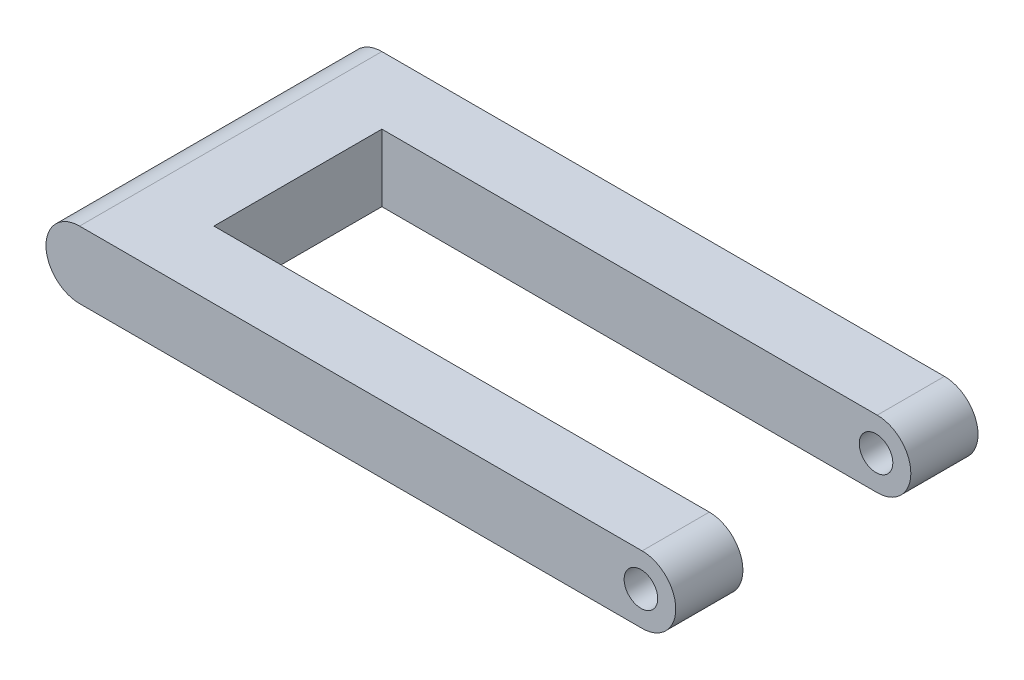
ISO-10303-21;
HEADER;
FILE_DESCRIPTION(('STEP AP214'),'2;1');
FILE_NAME('part.step','',(''),(''),'','','');
FILE_SCHEMA(('AUTOMOTIVE_DESIGN { 1 0 10303 214 1 1 1 1 }'));
ENDSEC;
DATA;
#1=APPLICATION_CONTEXT('core data for automotive mechanical design processes');
#2=APPLICATION_PROTOCOL_DEFINITION('international standard','automotive_design',2000,#1);
#3=PRODUCT_CONTEXT('',#1,'mechanical');
#4=PRODUCT('Part','Part','',(#3));
#5=PRODUCT_RELATED_PRODUCT_CATEGORY('part','',(#4));
#6=PRODUCT_DEFINITION_FORMATION('','',#4);
#7=PRODUCT_DEFINITION_CONTEXT('part definition',#1,'design');
#8=PRODUCT_DEFINITION('design','',#6,#7);
#9=PRODUCT_DEFINITION_SHAPE('','',#8);
#10=(LENGTH_UNIT() NAMED_UNIT(*) SI_UNIT(.MILLI.,.METRE.));
#11=(NAMED_UNIT(*) PLANE_ANGLE_UNIT() SI_UNIT($,.RADIAN.));
#12=(NAMED_UNIT(*) SI_UNIT($,.STERADIAN.) SOLID_ANGLE_UNIT());
#13=UNCERTAINTY_MEASURE_WITH_UNIT(LENGTH_MEASURE(1.E-05),#10,'distance_accuracy_value','');
#14=(GEOMETRIC_REPRESENTATION_CONTEXT(3) GLOBAL_UNCERTAINTY_ASSIGNED_CONTEXT((#13)) GLOBAL_UNIT_ASSIGNED_CONTEXT((#10,
#11,#12)) REPRESENTATION_CONTEXT('',''));
#15=CARTESIAN_POINT('',(0.,0.,0.));
#16=DIRECTION('',(0.,0.,1.));
#17=DIRECTION('',(1.,0.,0.));
#18=AXIS2_PLACEMENT_3D('',#15,#16,#17);
#19=CARTESIAN_POINT('',(0.,2.,4.));
#20=DIRECTION('',(0.,0.,-1.));
#21=DIRECTION('',(-1.,0.,0.));
#22=AXIS2_PLACEMENT_3D('',#19,#20,#21);
#23=CYLINDRICAL_SURFACE('',#22,2.);
#24=CARTESIAN_POINT('',(0.,2.,0.));
#25=DIRECTION('',(0.,0.,1.));
#26=DIRECTION('',(1.,0.,0.));
#27=AXIS2_PLACEMENT_3D('',#24,#25,#26);
#28=CIRCLE('',#27,2.);
#29=CARTESIAN_POINT('',(0.,4.,0.));
#30=VERTEX_POINT('',#29);
#31=CARTESIAN_POINT('',(0.,0.,0.));
#32=VERTEX_POINT('',#31);
#33=EDGE_CURVE('E96',#30,#32,#28,.T.);
#34=ORIENTED_EDGE('',*,*,#33,.T.);
#35=DIRECTION('',(0.,0.,-1.));
#36=VECTOR('',#35,1.);
#37=CARTESIAN_POINT('',(0.,0.,4.));
#38=LINE('',#37,#36);
#39=CARTESIAN_POINT('',(0.,0.,18.));
#40=VERTEX_POINT('',#39);
#41=EDGE_CURVE('E11',#40,#32,#38,.T.);
#42=ORIENTED_EDGE('',*,*,#41,.F.);
#43=CARTESIAN_POINT('',(0.,2.,18.));
#44=DIRECTION('',(0.,0.,1.));
#45=DIRECTION('',(1.,0.,0.));
#46=AXIS2_PLACEMENT_3D('',#43,#44,#45);
#47=CIRCLE('',#46,2.);
#48=CARTESIAN_POINT('',(0.,4.,18.));
#49=VERTEX_POINT('',#48);
#50=EDGE_CURVE('E98',#49,#40,#47,.T.);
#51=ORIENTED_EDGE('',*,*,#50,.F.);
#52=DIRECTION('',(0.,0.,-1.));
#53=VECTOR('',#52,1.);
#54=CARTESIAN_POINT('',(0.,4.,4.));
#55=LINE('',#54,#53);
#56=EDGE_CURVE('E82',#49,#30,#55,.T.);
#57=ORIENTED_EDGE('',*,*,#56,.T.);
#58=EDGE_LOOP('',(#34,#42,#51,#57));
#59=FACE_BOUND('',#58,.T.);
#60=ADVANCED_FACE('F37',(#59),#23,.T.);
#61=CARTESIAN_POINT('',(0.,0.,4.));
#62=DIRECTION('',(0.,1.,0.));
#63=DIRECTION('',(0.,0.,1.));
#64=AXIS2_PLACEMENT_3D('',#61,#62,#63);
#65=PLANE('',#64);
#66=DIRECTION('',(1.,0.,0.));
#67=VECTOR('',#66,1.);
#68=CARTESIAN_POINT('',(0.,0.,0.));
#69=LINE('',#68,#67);
#70=CARTESIAN_POINT('',(33.5,0.,0.));
#71=VERTEX_POINT('',#70);
#72=EDGE_CURVE('E102',#32,#71,#69,.T.);
#73=ORIENTED_EDGE('',*,*,#72,.T.);
#74=DIRECTION('',(0.,0.,-1.));
#75=VECTOR('',#74,1.);
#76=CARTESIAN_POINT('',(33.5,0.,4.));
#77=LINE('',#76,#75);
#78=CARTESIAN_POINT('',(33.5,0.,4.));
#79=VERTEX_POINT('',#78);
#80=EDGE_CURVE('E44',#79,#71,#77,.T.);
#81=ORIENTED_EDGE('',*,*,#80,.F.);
#82=DIRECTION('',(1.,0.,0.));
#83=VECTOR('',#82,1.);
#84=CARTESIAN_POINT('',(0.,0.,4.));
#85=LINE('',#84,#83);
#86=CARTESIAN_POINT('',(4.,0.,4.));
#87=VERTEX_POINT('',#86);
#88=EDGE_CURVE('E89',#87,#79,#85,.T.);
#89=ORIENTED_EDGE('',*,*,#88,.F.);
#90=DIRECTION('',(0.,0.,-1.));
#91=VECTOR('',#90,1.);
#92=CARTESIAN_POINT('',(4.,0.,14.));
#93=LINE('',#92,#91);
#94=CARTESIAN_POINT('',(4.,0.,14.));
#95=VERTEX_POINT('',#94);
#96=EDGE_CURVE('E107',#95,#87,#93,.T.);
#97=ORIENTED_EDGE('',*,*,#96,.F.);
#98=DIRECTION('',(1.,0.,0.));
#99=VECTOR('',#98,1.);
#100=CARTESIAN_POINT('',(33.5,0.,14.));
#101=LINE('',#100,#99);
#102=CARTESIAN_POINT('',(33.5,0.,14.));
#103=VERTEX_POINT('',#102);
#104=EDGE_CURVE('E168',#95,#103,#101,.T.);
#105=ORIENTED_EDGE('',*,*,#104,.T.);
#106=DIRECTION('',(0.,0.,-1.));
#107=VECTOR('',#106,1.);
#108=CARTESIAN_POINT('',(33.5,0.,18.));
#109=LINE('',#108,#107);
#110=CARTESIAN_POINT('',(33.5,0.,18.));
#111=VERTEX_POINT('',#110);
#112=EDGE_CURVE('E154',#111,#103,#109,.T.);
#113=ORIENTED_EDGE('',*,*,#112,.F.);
#114=DIRECTION('',(1.,0.,0.));
#115=VECTOR('',#114,1.);
#116=CARTESIAN_POINT('',(33.5,0.,18.));
#117=LINE('',#116,#115);
#118=EDGE_CURVE('E125',#40,#111,#117,.T.);
#119=ORIENTED_EDGE('',*,*,#118,.F.);
#120=ORIENTED_EDGE('',*,*,#41,.T.);
#121=EDGE_LOOP('',(#73,#81,#89,#97,#105,#113,#119,#120));
#122=FACE_BOUND('',#121,.T.);
#123=ADVANCED_FACE('F118',(#122),#65,.F.);
#124=CARTESIAN_POINT('',(33.5,2.,4.));
#125=DIRECTION('',(0.,0.,-1.));
#126=DIRECTION('',(-1.,0.,0.));
#127=AXIS2_PLACEMENT_3D('',#124,#125,#126);
#128=CYLINDRICAL_SURFACE('',#127,2.);
#129=CARTESIAN_POINT('',(33.5,2.,0.));
#130=DIRECTION('',(0.,0.,1.));
#131=DIRECTION('',(-1.,0.,0.));
#132=AXIS2_PLACEMENT_3D('',#129,#130,#131);
#133=CIRCLE('',#132,2.);
#134=CARTESIAN_POINT('',(33.5,4.,0.));
#135=VERTEX_POINT('',#134);
#136=EDGE_CURVE('E90',#71,#135,#133,.T.);
#137=ORIENTED_EDGE('',*,*,#136,.T.);
#138=DIRECTION('',(0.,0.,-1.));
#139=VECTOR('',#138,1.);
#140=CARTESIAN_POINT('',(33.5,4.,4.));
#141=LINE('',#140,#139);
#142=CARTESIAN_POINT('',(33.5,4.,4.));
#143=VERTEX_POINT('',#142);
#144=EDGE_CURVE('E85',#143,#135,#141,.T.);
#145=ORIENTED_EDGE('',*,*,#144,.F.);
#146=CARTESIAN_POINT('',(33.5,2.,4.));
#147=DIRECTION('',(0.,0.,1.));
#148=DIRECTION('',(-1.,0.,0.));
#149=AXIS2_PLACEMENT_3D('',#146,#147,#148);
#150=CIRCLE('',#149,2.);
#151=EDGE_CURVE('E57',#79,#143,#150,.T.);
#152=ORIENTED_EDGE('',*,*,#151,.F.);
#153=ORIENTED_EDGE('',*,*,#80,.T.);
#154=EDGE_LOOP('',(#137,#145,#152,#153));
#155=FACE_BOUND('',#154,.T.);
#156=ADVANCED_FACE('F116',(#155),#128,.T.);
#157=CARTESIAN_POINT('',(0.,4.,4.));
#158=DIRECTION('',(0.,-1.,0.));
#159=DIRECTION('',(0.,0.,-1.));
#160=AXIS2_PLACEMENT_3D('',#157,#158,#159);
#161=PLANE('',#160);
#162=DIRECTION('',(-1.,0.,0.));
#163=VECTOR('',#162,1.);
#164=CARTESIAN_POINT('',(0.,4.,0.));
#165=LINE('',#164,#163);
#166=EDGE_CURVE('E77',#135,#30,#165,.T.);
#167=ORIENTED_EDGE('',*,*,#166,.T.);
#168=ORIENTED_EDGE('',*,*,#56,.F.);
#169=DIRECTION('',(-1.,0.,0.));
#170=VECTOR('',#169,1.);
#171=CARTESIAN_POINT('',(0.,4.,18.));
#172=LINE('',#171,#170);
#173=CARTESIAN_POINT('',(33.5,4.,18.));
#174=VERTEX_POINT('',#173);
#175=EDGE_CURVE('E164',#174,#49,#172,.T.);
#176=ORIENTED_EDGE('',*,*,#175,.F.);
#177=DIRECTION('',(0.,0.,-1.));
#178=VECTOR('',#177,1.);
#179=CARTESIAN_POINT('',(33.5,4.,18.));
#180=LINE('',#179,#178);
#181=CARTESIAN_POINT('',(33.5,4.,14.));
#182=VERTEX_POINT('',#181);
#183=EDGE_CURVE('E158',#174,#182,#180,.T.);
#184=ORIENTED_EDGE('',*,*,#183,.T.);
#185=DIRECTION('',(-1.,0.,0.));
#186=VECTOR('',#185,1.);
#187=CARTESIAN_POINT('',(0.,4.,14.));
#188=LINE('',#187,#186);
#189=CARTESIAN_POINT('',(4.,4.,14.));
#190=VERTEX_POINT('',#189);
#191=EDGE_CURVE('E148',#182,#190,#188,.T.);
#192=ORIENTED_EDGE('',*,*,#191,.T.);
#193=DIRECTION('',(0.,0.,-1.));
#194=VECTOR('',#193,1.);
#195=CARTESIAN_POINT('',(4.,4.,14.));
#196=LINE('',#195,#194);
#197=CARTESIAN_POINT('',(4.,4.,4.));
#198=VERTEX_POINT('',#197);
#199=EDGE_CURVE('E103',#190,#198,#196,.T.);
#200=ORIENTED_EDGE('',*,*,#199,.T.);
#201=DIRECTION('',(-1.,0.,0.));
#202=VECTOR('',#201,1.);
#203=CARTESIAN_POINT('',(0.,4.,4.));
#204=LINE('',#203,#202);
#205=EDGE_CURVE('E99',#143,#198,#204,.T.);
#206=ORIENTED_EDGE('',*,*,#205,.F.);
#207=ORIENTED_EDGE('',*,*,#144,.T.);
#208=EDGE_LOOP('',(#167,#168,#176,#184,#192,#200,#206,#207));
#209=FACE_BOUND('',#208,.T.);
#210=ADVANCED_FACE('F79',(#209),#161,.F.);
#211=CARTESIAN_POINT('',(0.,2.,4.));
#212=DIRECTION('',(0.,0.,1.));
#213=DIRECTION('',(1.,0.,0.));
#214=AXIS2_PLACEMENT_3D('',#211,#212,#213);
#215=PLANE('',#214);
#216=CARTESIAN_POINT('',(33.4272578061534,2.,4.));
#217=DIRECTION('',(0.,0.,1.));
#218=DIRECTION('',(1.,0.,0.));
#219=AXIS2_PLACEMENT_3D('',#216,#217,#218);
#220=CIRCLE('',#219,0.999999999999998);
#221=CARTESIAN_POINT('',(34.4272578061534,2.,4.));
#222=VERTEX_POINT('',#221);
#223=EDGE_CURVE('E170',#222,#222,#220,.T.);
#224=ORIENTED_EDGE('',*,*,#223,.F.);
#225=EDGE_LOOP('',(#224));
#226=FACE_BOUND('',#225,.T.);
#227=DIRECTION('',(0.,1.,0.));
#228=VECTOR('',#227,1.);
#229=CARTESIAN_POINT('',(4.,0.,4.));
#230=LINE('',#229,#228);
#231=EDGE_CURVE('E51',#87,#198,#230,.T.);
#232=ORIENTED_EDGE('',*,*,#231,.F.);
#233=ORIENTED_EDGE('',*,*,#88,.T.);
#234=ORIENTED_EDGE('',*,*,#151,.T.);
#235=ORIENTED_EDGE('',*,*,#205,.T.);
#236=EDGE_LOOP('',(#232,#233,#234,#235));
#237=FACE_BOUND('',#236,.T.);
#238=ADVANCED_FACE('F144',(#226,#237),#215,.T.);
#239=CARTESIAN_POINT('',(0.,2.,0.));
#240=DIRECTION('',(0.,0.,1.));
#241=DIRECTION('',(1.,0.,0.));
#242=AXIS2_PLACEMENT_3D('',#239,#240,#241);
#243=PLANE('',#242);
#244=CARTESIAN_POINT('',(33.4272578061534,2.,0.));
#245=DIRECTION('',(0.,0.,1.));
#246=DIRECTION('',(1.,0.,0.));
#247=AXIS2_PLACEMENT_3D('',#244,#245,#246);
#248=CIRCLE('',#247,0.999999999999998);
#249=CARTESIAN_POINT('',(34.4272578061534,2.,0.));
#250=VERTEX_POINT('',#249);
#251=EDGE_CURVE('E178',#250,#250,#248,.T.);
#252=ORIENTED_EDGE('',*,*,#251,.T.);
#253=EDGE_LOOP('',(#252));
#254=FACE_BOUND('',#253,.T.);
#255=ORIENTED_EDGE('',*,*,#33,.F.);
#256=ORIENTED_EDGE('',*,*,#166,.F.);
#257=ORIENTED_EDGE('',*,*,#136,.F.);
#258=ORIENTED_EDGE('',*,*,#72,.F.);
#259=EDGE_LOOP('',(#255,#256,#257,#258));
#260=FACE_BOUND('',#259,.T.);
#261=ADVANCED_FACE('F101',(#254,#260),#243,.F.);
#262=CARTESIAN_POINT('',(4.,0.,14.));
#263=DIRECTION('',(-1.,0.,0.));
#264=DIRECTION('',(0.,0.,1.));
#265=AXIS2_PLACEMENT_3D('',#262,#263,#264);
#266=PLANE('',#265);
#267=ORIENTED_EDGE('',*,*,#231,.T.);
#268=ORIENTED_EDGE('',*,*,#199,.F.);
#269=DIRECTION('',(0.,1.,0.));
#270=VECTOR('',#269,1.);
#271=CARTESIAN_POINT('',(4.,0.,14.));
#272=LINE('',#271,#270);
#273=EDGE_CURVE('E153',#95,#190,#272,.T.);
#274=ORIENTED_EDGE('',*,*,#273,.F.);
#275=ORIENTED_EDGE('',*,*,#96,.T.);
#276=EDGE_LOOP('',(#267,#268,#274,#275));
#277=FACE_BOUND('',#276,.T.);
#278=ADVANCED_FACE('F152',(#277),#266,.F.);
#279=CARTESIAN_POINT('',(0.,2.,14.));
#280=DIRECTION('',(0.,0.,1.));
#281=DIRECTION('',(1.,0.,0.));
#282=AXIS2_PLACEMENT_3D('',#279,#280,#281);
#283=PLANE('',#282);
#284=CARTESIAN_POINT('',(33.4272578061534,2.,14.));
#285=DIRECTION('',(0.,0.,1.));
#286=DIRECTION('',(1.,0.,0.));
#287=AXIS2_PLACEMENT_3D('',#284,#285,#286);
#288=CIRCLE('',#287,0.999999999999998);
#289=CARTESIAN_POINT('',(34.4272578061534,2.,14.));
#290=VERTEX_POINT('',#289);
#291=EDGE_CURVE('E181',#290,#290,#288,.T.);
#292=ORIENTED_EDGE('',*,*,#291,.T.);
#293=EDGE_LOOP('',(#292));
#294=FACE_BOUND('',#293,.T.);
#295=ORIENTED_EDGE('',*,*,#104,.F.);
#296=ORIENTED_EDGE('',*,*,#273,.T.);
#297=ORIENTED_EDGE('',*,*,#191,.F.);
#298=CARTESIAN_POINT('',(33.5,2.,14.));
#299=DIRECTION('',(0.,0.,1.));
#300=DIRECTION('',(-1.,0.,0.));
#301=AXIS2_PLACEMENT_3D('',#298,#299,#300);
#302=CIRCLE('',#301,2.);
#303=EDGE_CURVE('E166',#103,#182,#302,.T.);
#304=ORIENTED_EDGE('',*,*,#303,.F.);
#305=EDGE_LOOP('',(#295,#296,#297,#304));
#306=FACE_BOUND('',#305,.T.);
#307=ADVANCED_FACE('F202',(#294,#306),#283,.F.);
#308=CARTESIAN_POINT('',(33.5,2.,18.));
#309=DIRECTION('',(0.,0.,-1.));
#310=DIRECTION('',(-1.,0.,0.));
#311=AXIS2_PLACEMENT_3D('',#308,#309,#310);
#312=CYLINDRICAL_SURFACE('',#311,2.);
#313=ORIENTED_EDGE('',*,*,#303,.T.);
#314=ORIENTED_EDGE('',*,*,#183,.F.);
#315=CARTESIAN_POINT('',(33.5,2.,18.));
#316=DIRECTION('',(0.,0.,1.));
#317=DIRECTION('',(-1.,0.,0.));
#318=AXIS2_PLACEMENT_3D('',#315,#316,#317);
#319=CIRCLE('',#318,2.);
#320=EDGE_CURVE('E172',#111,#174,#319,.T.);
#321=ORIENTED_EDGE('',*,*,#320,.F.);
#322=ORIENTED_EDGE('',*,*,#112,.T.);
#323=EDGE_LOOP('',(#313,#314,#321,#322));
#324=FACE_BOUND('',#323,.T.);
#325=ADVANCED_FACE('F194',(#324),#312,.T.);
#326=CARTESIAN_POINT('',(0.,2.,18.));
#327=DIRECTION('',(0.,0.,1.));
#328=DIRECTION('',(1.,0.,0.));
#329=AXIS2_PLACEMENT_3D('',#326,#327,#328);
#330=PLANE('',#329);
#331=CARTESIAN_POINT('',(33.4272578061534,2.,18.));
#332=DIRECTION('',(0.,0.,1.));
#333=DIRECTION('',(1.,0.,0.));
#334=AXIS2_PLACEMENT_3D('',#331,#332,#333);
#335=CIRCLE('',#334,0.999999999999998);
#336=CARTESIAN_POINT('',(34.4272578061534,2.,18.));
#337=VERTEX_POINT('',#336);
#338=EDGE_CURVE('E184',#337,#337,#335,.T.);
#339=ORIENTED_EDGE('',*,*,#338,.F.);
#340=EDGE_LOOP('',(#339));
#341=FACE_BOUND('',#340,.T.);
#342=ORIENTED_EDGE('',*,*,#50,.T.);
#343=ORIENTED_EDGE('',*,*,#118,.T.);
#344=ORIENTED_EDGE('',*,*,#320,.T.);
#345=ORIENTED_EDGE('',*,*,#175,.T.);
#346=EDGE_LOOP('',(#342,#343,#344,#345));
#347=FACE_BOUND('',#346,.T.);
#348=ADVANCED_FACE('F191',(#341,#347),#330,.T.);
#349=CARTESIAN_POINT('',(33.4272578061534,2.,-8.00000000000001));
#350=DIRECTION('',(0.,0.,1.));
#351=DIRECTION('',(1.,0.,0.));
#352=AXIS2_PLACEMENT_3D('',#349,#350,#351);
#353=CYLINDRICAL_SURFACE('',#352,0.999999999999998);
#354=CARTESIAN_POINT('',(34.4272578061534,2.,18.));
#355=CARTESIAN_POINT('',(34.4272578061534,2.,17.9583333333333));
#356=CARTESIAN_POINT('',(34.4272578061534,2.,17.9166666666667));
#357=CARTESIAN_POINT('',(34.4272578061534,2.,17.8333333333333));
#358=CARTESIAN_POINT('',(34.4272578061534,2.,17.7916666666667));
#359=CARTESIAN_POINT('',(34.4272578061534,2.,17.7083333333333));
#360=CARTESIAN_POINT('',(34.4272578061534,2.,17.6666666666667));
#361=CARTESIAN_POINT('',(34.4272578061534,2.,17.5833333333333));
#362=CARTESIAN_POINT('',(34.4272578061534,2.,17.5416666666667));
#363=CARTESIAN_POINT('',(34.4272578061534,2.,17.4583333333333));
#364=CARTESIAN_POINT('',(34.4272578061534,2.,17.4166666666667));
#365=CARTESIAN_POINT('',(34.4272578061534,2.,17.3333333333333));
#366=CARTESIAN_POINT('',(34.4272578061534,2.,17.2916666666667));
#367=CARTESIAN_POINT('',(34.4272578061534,2.,17.2083333333333));
#368=CARTESIAN_POINT('',(34.4272578061534,2.,17.1666666666667));
#369=CARTESIAN_POINT('',(34.4272578061534,2.,17.0833333333333));
#370=CARTESIAN_POINT('',(34.4272578061534,2.,17.0416666666667));
#371=CARTESIAN_POINT('',(34.4272578061534,2.,16.9583333333333));
#372=CARTESIAN_POINT('',(34.4272578061534,2.,16.9166666666667));
#373=CARTESIAN_POINT('',(34.4272578061534,2.,16.8333333333333));
#374=CARTESIAN_POINT('',(34.4272578061534,2.,16.7916666666667));
#375=CARTESIAN_POINT('',(34.4272578061534,2.,16.7083333333333));
#376=CARTESIAN_POINT('',(34.4272578061534,2.,16.6666666666667));
#377=CARTESIAN_POINT('',(34.4272578061534,2.,16.5833333333333));
#378=CARTESIAN_POINT('',(34.4272578061534,2.,16.5416666666667));
#379=CARTESIAN_POINT('',(34.4272578061534,2.,16.4583333333333));
#380=CARTESIAN_POINT('',(34.4272578061534,2.,16.4166666666667));
#381=CARTESIAN_POINT('',(34.4272578061534,2.,16.3333333333333));
#382=CARTESIAN_POINT('',(34.4272578061534,2.,16.2916666666667));
#383=CARTESIAN_POINT('',(34.4272578061534,2.,16.2083333333333));
#384=CARTESIAN_POINT('',(34.4272578061534,2.,16.1666666666667));
#385=CARTESIAN_POINT('',(34.4272578061534,2.,16.0833333333333));
#386=CARTESIAN_POINT('',(34.4272578061534,2.,16.0416666666667));
#387=CARTESIAN_POINT('',(34.4272578061534,2.,15.9583333333333));
#388=CARTESIAN_POINT('',(34.4272578061534,2.,15.9166666666667));
#389=CARTESIAN_POINT('',(34.4272578061534,2.,15.8333333333333));
#390=CARTESIAN_POINT('',(34.4272578061534,2.,15.7916666666667));
#391=CARTESIAN_POINT('',(34.4272578061534,2.,15.7083333333333));
#392=CARTESIAN_POINT('',(34.4272578061534,2.,15.6666666666667));
#393=CARTESIAN_POINT('',(34.4272578061534,2.,15.5833333333333));
#394=CARTESIAN_POINT('',(34.4272578061534,2.,15.5416666666667));
#395=CARTESIAN_POINT('',(34.4272578061534,2.,15.4583333333333));
#396=CARTESIAN_POINT('',(34.4272578061534,2.,15.4166666666667));
#397=CARTESIAN_POINT('',(34.4272578061534,2.,15.3333333333333));
#398=CARTESIAN_POINT('',(34.4272578061534,2.,15.2916666666667));
#399=CARTESIAN_POINT('',(34.4272578061534,2.,15.2083333333333));
#400=CARTESIAN_POINT('',(34.4272578061534,2.,15.1666666666667));
#401=CARTESIAN_POINT('',(34.4272578061534,2.,15.0833333333333));
#402=CARTESIAN_POINT('',(34.4272578061534,2.,15.0416666666667));
#403=CARTESIAN_POINT('',(34.4272578061534,2.,14.9583333333333));
#404=CARTESIAN_POINT('',(34.4272578061534,2.,14.9166666666667));
#405=CARTESIAN_POINT('',(34.4272578061534,2.,14.8333333333333));
#406=CARTESIAN_POINT('',(34.4272578061534,2.,14.7916666666667));
#407=CARTESIAN_POINT('',(34.4272578061534,2.,14.7083333333333));
#408=CARTESIAN_POINT('',(34.4272578061534,2.,14.6666666666667));
#409=CARTESIAN_POINT('',(34.4272578061534,2.,14.5833333333333));
#410=CARTESIAN_POINT('',(34.4272578061534,2.,14.5416666666667));
#411=CARTESIAN_POINT('',(34.4272578061534,2.,14.4583333333333));
#412=CARTESIAN_POINT('',(34.4272578061534,2.,14.4166666666667));
#413=CARTESIAN_POINT('',(34.4272578061534,2.,14.3333333333333));
#414=CARTESIAN_POINT('',(34.4272578061534,2.,14.2916666666667));
#415=CARTESIAN_POINT('',(34.4272578061534,2.,14.2083333333333));
#416=CARTESIAN_POINT('',(34.4272578061534,2.,14.1666666666667));
#417=CARTESIAN_POINT('',(34.4272578061534,2.,14.0833333333333));
#418=CARTESIAN_POINT('',(34.4272578061534,2.,14.0416666666667));
#419=CARTESIAN_POINT('',(34.4272578061534,2.,14.));
#420=B_SPLINE_CURVE_WITH_KNOTS('',3,(#354,#355,#356,#357,#358,#359,#360,#361,#362,#363,#364,
#365,#366,#367,#368,#369,#370,#371,#372,#373,#374,#375,#376,#377,#378,#379,#380,#381,#382,#383,
#384,#385,#386,#387,#388,#389,#390,#391,#392,#393,#394,#395,#396,#397,#398,#399,#400,#401,#402,
#403,#404,#405,#406,#407,#408,#409,#410,#411,#412,#413,#414,#415,#416,#417,#418,#419),
.UNSPECIFIED.,.F.,.F.,(4,2,2,2,2,2,2,2,2,2,2,2,2,2,2,2,2,2,2,2,2,2,2,2,2,2,2,2,2,2,2,2,4),(0.,
0.125,0.25,0.375,0.5,0.625000000000001,0.750000000000001,0.875000000000001,1.,1.125,1.25,1.375,
1.5,1.625,1.75,1.875,2.,2.125,2.25,2.375,2.5,2.625,2.75,2.875,3.,3.125,3.25,3.375,3.5,3.625,
3.75,3.875,4.),.UNSPECIFIED.);
#421=EDGE_CURVE('BSEAM188',#337,#290,#420,.T.);
#422=ORIENTED_EDGE('',*,*,#338,.T.);
#423=ORIENTED_EDGE('',*,*,#291,.F.);
#424=ORIENTED_EDGE('',*,*,#421,.T.);
#425=ORIENTED_EDGE('',*,*,#421,.F.);
#426=EDGE_LOOP('',(#422,#424,#423,#425));
#427=FACE_BOUND('',#426,.T.);
#428=ADVANCED_FACE('F188',(#427),#353,.F.);
#429=CARTESIAN_POINT('',(34.4272578061534,2.,4.));
#430=CARTESIAN_POINT('',(34.4272578061534,2.,3.95833333333333));
#431=CARTESIAN_POINT('',(34.4272578061534,2.,3.91666666666666));
#432=CARTESIAN_POINT('',(34.4272578061534,2.,3.83333333333333));
#433=CARTESIAN_POINT('',(34.4272578061534,2.,3.79166666666667));
#434=CARTESIAN_POINT('',(34.4272578061534,2.,3.70833333333333));
#435=CARTESIAN_POINT('',(34.4272578061534,2.,3.66666666666666));
#436=CARTESIAN_POINT('',(34.4272578061534,2.,3.58333333333333));
#437=CARTESIAN_POINT('',(34.4272578061534,2.,3.54166666666666));
#438=CARTESIAN_POINT('',(34.4272578061534,2.,3.45833333333333));
#439=CARTESIAN_POINT('',(34.4272578061534,2.,3.41666666666666));
#440=CARTESIAN_POINT('',(34.4272578061534,2.,3.33333333333333));
#441=CARTESIAN_POINT('',(34.4272578061534,2.,3.29166666666666));
#442=CARTESIAN_POINT('',(34.4272578061534,2.,3.20833333333333));
#443=CARTESIAN_POINT('',(34.4272578061534,2.,3.16666666666666));
#444=CARTESIAN_POINT('',(34.4272578061534,2.,3.08333333333333));
#445=CARTESIAN_POINT('',(34.4272578061534,2.,3.04166666666666));
#446=CARTESIAN_POINT('',(34.4272578061534,2.,2.95833333333333));
#447=CARTESIAN_POINT('',(34.4272578061534,2.,2.91666666666666));
#448=CARTESIAN_POINT('',(34.4272578061534,2.,2.83333333333333));
#449=CARTESIAN_POINT('',(34.4272578061534,2.,2.79166666666666));
#450=CARTESIAN_POINT('',(34.4272578061534,2.,2.70833333333333));
#451=CARTESIAN_POINT('',(34.4272578061534,2.,2.66666666666667));
#452=CARTESIAN_POINT('',(34.4272578061534,2.,2.58333333333333));
#453=CARTESIAN_POINT('',(34.4272578061534,2.,2.54166666666667));
#454=CARTESIAN_POINT('',(34.4272578061534,2.,2.45833333333333));
#455=CARTESIAN_POINT('',(34.4272578061534,2.,2.41666666666667));
#456=CARTESIAN_POINT('',(34.4272578061534,2.,2.33333333333333));
#457=CARTESIAN_POINT('',(34.4272578061534,2.,2.29166666666667));
#458=CARTESIAN_POINT('',(34.4272578061534,2.,2.20833333333333));
#459=CARTESIAN_POINT('',(34.4272578061534,2.,2.16666666666667));
#460=CARTESIAN_POINT('',(34.4272578061534,2.,2.08333333333333));
#461=CARTESIAN_POINT('',(34.4272578061534,2.,2.04166666666667));
#462=CARTESIAN_POINT('',(34.4272578061534,2.,1.95833333333333));
#463=CARTESIAN_POINT('',(34.4272578061534,2.,1.91666666666666));
#464=CARTESIAN_POINT('',(34.4272578061534,2.,1.83333333333333));
#465=CARTESIAN_POINT('',(34.4272578061534,2.,1.79166666666666));
#466=CARTESIAN_POINT('',(34.4272578061534,2.,1.70833333333333));
#467=CARTESIAN_POINT('',(34.4272578061534,2.,1.66666666666666));
#468=CARTESIAN_POINT('',(34.4272578061534,2.,1.58333333333333));
#469=CARTESIAN_POINT('',(34.4272578061534,2.,1.54166666666666));
#470=CARTESIAN_POINT('',(34.4272578061534,2.,1.45833333333333));
#471=CARTESIAN_POINT('',(34.4272578061534,2.,1.41666666666666));
#472=CARTESIAN_POINT('',(34.4272578061534,2.,1.33333333333333));
#473=CARTESIAN_POINT('',(34.4272578061534,2.,1.29166666666667));
#474=CARTESIAN_POINT('',(34.4272578061534,2.,1.20833333333333));
#475=CARTESIAN_POINT('',(34.4272578061534,2.,1.16666666666667));
#476=CARTESIAN_POINT('',(34.4272578061534,2.,1.08333333333333));
#477=CARTESIAN_POINT('',(34.4272578061534,2.,1.04166666666667));
#478=CARTESIAN_POINT('',(34.4272578061534,2.,0.958333333333332));
#479=CARTESIAN_POINT('',(34.4272578061534,2.,0.916666666666666));
#480=CARTESIAN_POINT('',(34.4272578061534,2.,0.833333333333332));
#481=CARTESIAN_POINT('',(34.4272578061534,2.,0.791666666666666));
#482=CARTESIAN_POINT('',(34.4272578061534,2.,0.708333333333332));
#483=CARTESIAN_POINT('',(34.4272578061534,2.,0.666666666666666));
#484=CARTESIAN_POINT('',(34.4272578061534,2.,0.583333333333332));
#485=CARTESIAN_POINT('',(34.4272578061534,2.,0.541666666666665));
#486=CARTESIAN_POINT('',(34.4272578061534,2.,0.458333333333332));
#487=CARTESIAN_POINT('',(34.4272578061534,2.,0.416666666666665));
#488=CARTESIAN_POINT('',(34.4272578061534,2.,0.333333333333332));
#489=CARTESIAN_POINT('',(34.4272578061534,2.,0.291666666666665));
#490=CARTESIAN_POINT('',(34.4272578061534,2.,0.208333333333332));
#491=CARTESIAN_POINT('',(34.4272578061534,2.,0.166666666666665));
#492=CARTESIAN_POINT('',(34.4272578061534,2.,0.0833333333333317));
#493=CARTESIAN_POINT('',(34.4272578061534,2.,0.0416666666666649));
#494=CARTESIAN_POINT('',(34.4272578061534,2.,0.));
#495=B_SPLINE_CURVE_WITH_KNOTS('',3,(#429,#430,#431,#432,#433,#434,#435,#436,#437,#438,#439,
#440,#441,#442,#443,#444,#445,#446,#447,#448,#449,#450,#451,#452,#453,#454,#455,#456,#457,#458,
#459,#460,#461,#462,#463,#464,#465,#466,#467,#468,#469,#470,#471,#472,#473,#474,#475,#476,#477,
#478,#479,#480,#481,#482,#483,#484,#485,#486,#487,#488,#489,#490,#491,#492,#493,#494),
.UNSPECIFIED.,.F.,.F.,(4,2,2,2,2,2,2,2,2,2,2,2,2,2,2,2,2,2,2,2,2,2,2,2,2,2,2,2,2,2,2,2,4),(0.,
0.125,0.25,0.375,0.5,0.625000000000001,0.750000000000001,0.875000000000001,1.,1.125,1.25,1.375,
1.5,1.625,1.75,1.875,2.,2.125,2.25,2.375,2.5,2.625,2.75,2.875,3.,3.125,3.25,3.375,3.5,3.625,
3.75,3.875,4.),.UNSPECIFIED.);
#496=EDGE_CURVE('BSEAM257',#222,#250,#495,.T.);
#497=ORIENTED_EDGE('',*,*,#223,.T.);
#498=ORIENTED_EDGE('',*,*,#251,.F.);
#499=ORIENTED_EDGE('',*,*,#496,.T.);
#500=ORIENTED_EDGE('',*,*,#496,.F.);
#501=EDGE_LOOP('',(#497,#499,#498,#500));
#502=FACE_BOUND('',#501,.T.);
#503=ADVANCED_FACE('F257',(#502),#353,.F.);
#504=CLOSED_SHELL('',(#60,#123,#156,#210,#238,#261,#278,#307,#325,#348,#428,#503));
#505=MANIFOLD_SOLID_BREP('B2',#504);
#506=ADVANCED_BREP_SHAPE_REPRESENTATION('',(#18,#505),#14);
#507=SHAPE_DEFINITION_REPRESENTATION(#9,#506);
ENDSEC;
END-ISO-10303-21;
